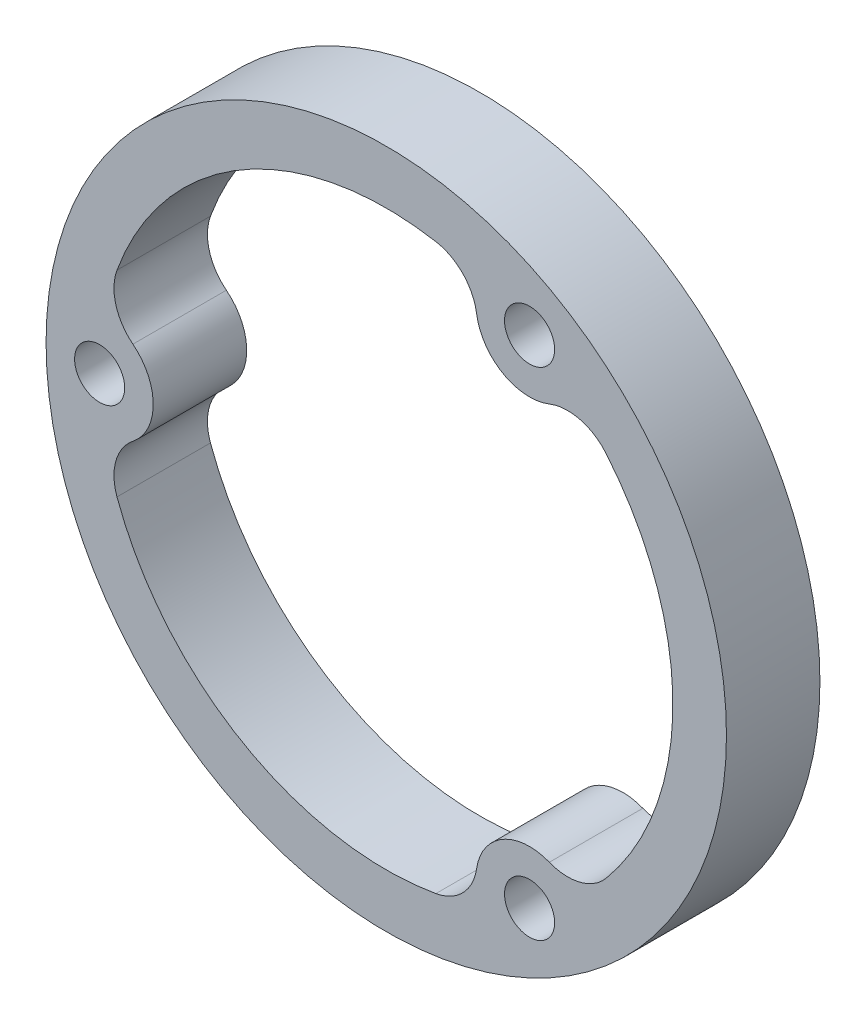
ISO-10303-21;
HEADER;
FILE_DESCRIPTION(('STEP AP214'),'2;1');
FILE_NAME('part.step','',(''),(''),'','','');
FILE_SCHEMA(('AUTOMOTIVE_DESIGN { 1 0 10303 214 1 1 1 1 }'));
ENDSEC;
DATA;
#1=APPLICATION_CONTEXT('core data for automotive mechanical design processes');
#2=APPLICATION_PROTOCOL_DEFINITION('international standard','automotive_design',2000,#1);
#3=PRODUCT_CONTEXT('',#1,'mechanical');
#4=PRODUCT('Part','Part','',(#3));
#5=PRODUCT_RELATED_PRODUCT_CATEGORY('part','',(#4));
#6=PRODUCT_DEFINITION_FORMATION('','',#4);
#7=PRODUCT_DEFINITION_CONTEXT('part definition',#1,'design');
#8=PRODUCT_DEFINITION('design','',#6,#7);
#9=PRODUCT_DEFINITION_SHAPE('','',#8);
#10=(LENGTH_UNIT() NAMED_UNIT(*) SI_UNIT(.MILLI.,.METRE.));
#11=(NAMED_UNIT(*) PLANE_ANGLE_UNIT() SI_UNIT($,.RADIAN.));
#12=(NAMED_UNIT(*) SI_UNIT($,.STERADIAN.) SOLID_ANGLE_UNIT());
#13=UNCERTAINTY_MEASURE_WITH_UNIT(LENGTH_MEASURE(1.E-05),#10,'distance_accuracy_value','');
#14=(GEOMETRIC_REPRESENTATION_CONTEXT(3) GLOBAL_UNCERTAINTY_ASSIGNED_CONTEXT((#13)) GLOBAL_UNIT_ASSIGNED_CONTEXT((#10,
#11,#12)) REPRESENTATION_CONTEXT('',''));
#15=CARTESIAN_POINT('',(0.,0.,0.));
#16=DIRECTION('',(0.,0.,1.));
#17=DIRECTION('',(1.,0.,0.));
#18=AXIS2_PLACEMENT_3D('',#15,#16,#17);
#19=CARTESIAN_POINT('',(0.,0.,9.525));
#20=DIRECTION('',(0.,0.,1.));
#21=DIRECTION('',(1.,0.,0.));
#22=AXIS2_PLACEMENT_3D('',#19,#20,#21);
#23=PLANE('',#22);
#24=CARTESIAN_POINT('',(14.6049999999998,25.2966020445436,9.525));
#25=DIRECTION('',(0.,0.,-1.));
#26=DIRECTION('',(-1.,0.,0.));
#27=AXIS2_PLACEMENT_3D('',#24,#25,#26);
#28=CIRCLE('',#27,2.5527);
#29=CARTESIAN_POINT('',(12.0522999999998,25.2966020445436,9.525));
#30=VERTEX_POINT('',#29);
#31=EDGE_CURVE('E419',#30,#30,#28,.T.);
#32=ORIENTED_EDGE('',*,*,#31,.T.);
#33=EDGE_LOOP('',(#32));
#34=FACE_BOUND('',#33,.T.);
#35=CARTESIAN_POINT('',(-29.21,-4.21584989140911E-13,9.525));
#36=DIRECTION('',(0.,0.,-1.));
#37=DIRECTION('',(-1.,0.,0.));
#38=AXIS2_PLACEMENT_3D('',#35,#36,#37);
#39=CIRCLE('',#38,2.5527);
#40=CARTESIAN_POINT('',(-31.7627,-4.21584989140911E-13,9.525));
#41=VERTEX_POINT('',#40);
#42=EDGE_CURVE('E429',#41,#41,#39,.T.);
#43=ORIENTED_EDGE('',*,*,#42,.T.);
#44=EDGE_LOOP('',(#43));
#45=FACE_BOUND('',#44,.T.);
#46=CARTESIAN_POINT('',(14.6050000000001,-25.2966020445434,9.525));
#47=DIRECTION('',(0.,0.,-1.));
#48=DIRECTION('',(-1.,0.,0.));
#49=AXIS2_PLACEMENT_3D('',#46,#47,#48);
#50=CIRCLE('',#49,2.5527);
#51=CARTESIAN_POINT('',(12.0523000000001,-25.2966020445434,9.525));
#52=VERTEX_POINT('',#51);
#53=EDGE_CURVE('E232',#52,#52,#50,.T.);
#54=ORIENTED_EDGE('',*,*,#53,.T.);
#55=EDGE_LOOP('',(#54));
#56=FACE_BOUND('',#55,.T.);
#57=CARTESIAN_POINT('',(0.,0.,9.525));
#58=DIRECTION('',(0.,0.,1.));
#59=DIRECTION('',(1.,0.,0.));
#60=AXIS2_PLACEMENT_3D('',#57,#58,#59);
#61=CIRCLE('',#60,34.671);
#62=CARTESIAN_POINT('',(-34.671,0.,9.525));
#63=VERTEX_POINT('',#62);
#64=EDGE_CURVE('E151',#63,#63,#61,.T.);
#65=ORIENTED_EDGE('',*,*,#64,.T.);
#66=EDGE_LOOP('',(#65));
#67=FACE_BOUND('',#66,.T.);
#68=CARTESIAN_POINT('',(-29.21,-4.21584989140911E-13,9.525));
#69=DIRECTION('',(0.,0.,-1.));
#70=DIRECTION('',(1.,0.,0.));
#71=AXIS2_PLACEMENT_3D('',#68,#69,#70);
#72=CIRCLE('',#71,5.46100000000001);
#73=CARTESIAN_POINT('',(-25.8216912257727,4.28274265517914,9.525));
#74=VERTEX_POINT('',#73);
#75=CARTESIAN_POINT('',(-25.8216912257726,-4.28274265517988,9.525));
#76=VERTEX_POINT('',#75);
#77=EDGE_CURVE('E212',#74,#76,#72,.T.);
#78=ORIENTED_EDGE('',*,*,#77,.F.);
#79=CARTESIAN_POINT('',(-22.6697760869566,8.26668931116012,9.525));
#80=DIRECTION('',(0.,0.,1.));
#81=DIRECTION('',(1.,0.,0.));
#82=AXIS2_PLACEMENT_3D('',#79,#80,#81);
#83=CIRCLE('',#82,5.08);
#84=CARTESIAN_POINT('',(-27.4423605263159,10.0070449556149,9.525));
#85=VERTEX_POINT('',#84);
#86=EDGE_CURVE('E196',#74,#85,#83,.F.);
#87=ORIENTED_EDGE('',*,*,#86,.T.);
#88=CARTESIAN_POINT('',(0.,0.,9.525));
#89=DIRECTION('',(0.,0.,1.));
#90=DIRECTION('',(1.,0.,0.));
#91=AXIS2_PLACEMENT_3D('',#88,#89,#90);
#92=CIRCLE('',#91,29.21);
#93=CARTESIAN_POINT('',(5.05482511478187,28.7693038334085,9.525));
#94=VERTEX_POINT('',#93);
#95=EDGE_CURVE('E147',#94,#85,#92,.T.);
#96=ORIENTED_EDGE('',*,*,#95,.F.);
#97=CARTESIAN_POINT('',(4.1757250948198,23.7659466449896,9.525));
#98=DIRECTION('',(0.,0.,1.));
#99=DIRECTION('',(1.,0.,0.));
#100=AXIS2_PLACEMENT_3D('',#97,#98,#99);
#101=CIRCLE('',#100,5.08);
#102=CARTESIAN_POINT('',(9.20188167562942,24.5036118977867,9.525));
#103=VERTEX_POINT('',#102);
#104=EDGE_CURVE('E137',#94,#103,#101,.F.);
#105=ORIENTED_EDGE('',*,*,#104,.T.);
#106=CARTESIAN_POINT('',(14.6049999999998,25.2966020445436,9.525));
#107=DIRECTION('',(0.,0.,-1.));
#108=DIRECTION('',(1.,0.,0.));
#109=AXIS2_PLACEMENT_3D('',#106,#107,#108);
#110=CIRCLE('',#109,5.46100000000001);
#111=CARTESIAN_POINT('',(16.6198095501428,20.2208692426073,9.525));
#112=VERTEX_POINT('',#111);
#113=EDGE_CURVE('E227',#112,#103,#110,.T.);
#114=ORIENTED_EDGE('',*,*,#113,.F.);
#115=CARTESIAN_POINT('',(18.4940509921363,15.4992573338293,9.525));
#116=DIRECTION('',(0.,0.,1.));
#117=DIRECTION('',(1.,0.,0.));
#118=AXIS2_PLACEMENT_3D('',#115,#116,#117);
#119=CIRCLE('',#118,5.08);
#120=CARTESIAN_POINT('',(22.3875354115334,18.7622588777934,9.525));
#121=VERTEX_POINT('',#120);
#122=EDGE_CURVE('E136',#112,#121,#119,.F.);
#123=ORIENTED_EDGE('',*,*,#122,.T.);
#124=CARTESIAN_POINT('',(0.,0.,9.525));
#125=DIRECTION('',(0.,0.,1.));
#126=DIRECTION('',(1.,0.,0.));
#127=AXIS2_PLACEMENT_3D('',#124,#125,#126);
#128=CIRCLE('',#127,29.21);
#129=CARTESIAN_POINT('',(22.3875354115337,-18.762258877793,9.525));
#130=VERTEX_POINT('',#129);
#131=EDGE_CURVE('E224',#130,#121,#128,.T.);
#132=ORIENTED_EDGE('',*,*,#131,.F.);
#133=CARTESIAN_POINT('',(18.4940509921366,-15.499257333829,9.525));
#134=DIRECTION('',(0.,0.,1.));
#135=DIRECTION('',(1.,0.,0.));
#136=AXIS2_PLACEMENT_3D('',#133,#134,#135);
#137=CIRCLE('',#136,5.08);
#138=CARTESIAN_POINT('',(16.6198095501431,-20.220869242607,9.525));
#139=VERTEX_POINT('',#138);
#140=EDGE_CURVE('E192',#130,#139,#137,.F.);
#141=ORIENTED_EDGE('',*,*,#140,.T.);
#142=CARTESIAN_POINT('',(14.6050000000001,-25.2966020445434,9.525));
#143=DIRECTION('',(0.,0.,-1.));
#144=DIRECTION('',(1.,0.,0.));
#145=AXIS2_PLACEMENT_3D('',#142,#143,#144);
#146=CIRCLE('',#145,5.46100000000001);
#147=CARTESIAN_POINT('',(9.20188167562977,-24.5036118977866,9.525));
#148=VERTEX_POINT('',#147);
#149=EDGE_CURVE('E216',#148,#139,#146,.T.);
#150=ORIENTED_EDGE('',*,*,#149,.F.);
#151=CARTESIAN_POINT('',(4.17572509482014,-23.7659466449895,9.525));
#152=DIRECTION('',(0.,0.,1.));
#153=DIRECTION('',(1.,0.,0.));
#154=AXIS2_PLACEMENT_3D('',#151,#152,#153);
#155=CIRCLE('',#154,5.08);
#156=CARTESIAN_POINT('',(5.05482511478227,-28.7693038334084,9.525));
#157=VERTEX_POINT('',#156);
#158=EDGE_CURVE('E188',#148,#157,#155,.F.);
#159=ORIENTED_EDGE('',*,*,#158,.T.);
#160=CARTESIAN_POINT('',(0.,0.,9.525));
#161=DIRECTION('',(0.,0.,1.));
#162=DIRECTION('',(1.,0.,0.));
#163=AXIS2_PLACEMENT_3D('',#160,#161,#162);
#164=CIRCLE('',#163,29.21);
#165=CARTESIAN_POINT('',(-27.4423605263156,-10.0070449556157,9.525));
#166=VERTEX_POINT('',#165);
#167=EDGE_CURVE('E214',#166,#157,#164,.T.);
#168=ORIENTED_EDGE('',*,*,#167,.F.);
#169=CARTESIAN_POINT('',(-22.6697760869564,-8.26668931116077,9.525));
#170=DIRECTION('',(0.,0.,1.));
#171=DIRECTION('',(1.,0.,0.));
#172=AXIS2_PLACEMENT_3D('',#169,#170,#171);
#173=CIRCLE('',#172,5.08);
#174=EDGE_CURVE('E11',#166,#76,#173,.F.);
#175=ORIENTED_EDGE('',*,*,#174,.T.);
#176=EDGE_LOOP('',(#78,#87,#96,#105,#114,#123,#132,#141,#150,#159,#168,#175));
#177=FACE_BOUND('',#176,.T.);
#178=ADVANCED_FACE('F37',(#34,#45,#56,#67,#177),#23,.T.);
#179=CARTESIAN_POINT('',(0.,0.,0.));
#180=DIRECTION('',(0.,0.,1.));
#181=DIRECTION('',(1.,0.,0.));
#182=AXIS2_PLACEMENT_3D('',#179,#180,#181);
#183=PLANE('',#182);
#184=CARTESIAN_POINT('',(14.6049999999998,25.2966020445436,0.));
#185=DIRECTION('',(0.,0.,-1.));
#186=DIRECTION('',(-1.,0.,0.));
#187=AXIS2_PLACEMENT_3D('',#184,#185,#186);
#188=CIRCLE('',#187,2.55269999999999);
#189=CARTESIAN_POINT('',(12.0522999999998,25.2966020445436,0.));
#190=VERTEX_POINT('',#189);
#191=EDGE_CURVE('E422',#190,#190,#188,.T.);
#192=ORIENTED_EDGE('',*,*,#191,.F.);
#193=EDGE_LOOP('',(#192));
#194=FACE_BOUND('',#193,.T.);
#195=CARTESIAN_POINT('',(-29.21,-4.21584989140911E-13,0.));
#196=DIRECTION('',(0.,0.,-1.));
#197=DIRECTION('',(-1.,0.,0.));
#198=AXIS2_PLACEMENT_3D('',#195,#196,#197);
#199=CIRCLE('',#198,2.55269999999999);
#200=CARTESIAN_POINT('',(-31.7627,-4.21584989140911E-13,0.));
#201=VERTEX_POINT('',#200);
#202=EDGE_CURVE('E424',#201,#201,#199,.T.);
#203=ORIENTED_EDGE('',*,*,#202,.F.);
#204=EDGE_LOOP('',(#203));
#205=FACE_BOUND('',#204,.T.);
#206=CARTESIAN_POINT('',(14.6050000000001,-25.2966020445434,0.));
#207=DIRECTION('',(0.,0.,-1.));
#208=DIRECTION('',(-1.,0.,0.));
#209=AXIS2_PLACEMENT_3D('',#206,#207,#208);
#210=CIRCLE('',#209,2.55269999999999);
#211=CARTESIAN_POINT('',(12.0523000000001,-25.2966020445434,0.));
#212=VERTEX_POINT('',#211);
#213=EDGE_CURVE('E432',#212,#212,#210,.T.);
#214=ORIENTED_EDGE('',*,*,#213,.F.);
#215=EDGE_LOOP('',(#214));
#216=FACE_BOUND('',#215,.T.);
#217=CARTESIAN_POINT('',(0.,0.,0.));
#218=DIRECTION('',(0.,0.,1.));
#219=DIRECTION('',(1.,0.,0.));
#220=AXIS2_PLACEMENT_3D('',#217,#218,#219);
#221=CIRCLE('',#220,34.671);
#222=CARTESIAN_POINT('',(-34.671,0.,0.));
#223=VERTEX_POINT('',#222);
#224=EDGE_CURVE('E156',#223,#223,#221,.T.);
#225=ORIENTED_EDGE('',*,*,#224,.F.);
#226=EDGE_LOOP('',(#225));
#227=FACE_BOUND('',#226,.T.);
#228=CARTESIAN_POINT('',(14.6049999999998,25.2966020445436,0.));
#229=DIRECTION('',(0.,0.,-1.));
#230=DIRECTION('',(1.,0.,0.));
#231=AXIS2_PLACEMENT_3D('',#228,#229,#230);
#232=CIRCLE('',#231,5.46100000000001);
#233=CARTESIAN_POINT('',(16.6198095501428,20.2208692426073,0.));
#234=VERTEX_POINT('',#233);
#235=CARTESIAN_POINT('',(9.20188167562942,24.5036118977867,0.));
#236=VERTEX_POINT('',#235);
#237=EDGE_CURVE('E129',#234,#236,#232,.T.);
#238=ORIENTED_EDGE('',*,*,#237,.T.);
#239=CARTESIAN_POINT('',(4.1757250948198,23.7659466449896,0.));
#240=DIRECTION('',(0.,0.,1.));
#241=DIRECTION('',(1.,0.,0.));
#242=AXIS2_PLACEMENT_3D('',#239,#240,#241);
#243=CIRCLE('',#242,5.08);
#244=CARTESIAN_POINT('',(5.05482511478187,28.7693038334085,0.));
#245=VERTEX_POINT('',#244);
#246=EDGE_CURVE('E182',#236,#245,#243,.T.);
#247=ORIENTED_EDGE('',*,*,#246,.T.);
#248=CARTESIAN_POINT('',(0.,0.,0.));
#249=DIRECTION('',(0.,0.,1.));
#250=DIRECTION('',(1.,0.,0.));
#251=AXIS2_PLACEMENT_3D('',#248,#249,#250);
#252=CIRCLE('',#251,29.21);
#253=CARTESIAN_POINT('',(-27.4423605263159,10.0070449556149,0.));
#254=VERTEX_POINT('',#253);
#255=EDGE_CURVE('E229',#245,#254,#252,.T.);
#256=ORIENTED_EDGE('',*,*,#255,.T.);
#257=CARTESIAN_POINT('',(-22.6697760869566,8.26668931116012,0.));
#258=DIRECTION('',(0.,0.,1.));
#259=DIRECTION('',(1.,0.,0.));
#260=AXIS2_PLACEMENT_3D('',#257,#258,#259);
#261=CIRCLE('',#260,5.08);
#262=CARTESIAN_POINT('',(-25.8216912257727,4.28274265517914,0.));
#263=VERTEX_POINT('',#262);
#264=EDGE_CURVE('E194',#254,#263,#261,.T.);
#265=ORIENTED_EDGE('',*,*,#264,.T.);
#266=CARTESIAN_POINT('',(-29.21,-4.21584989140911E-13,0.));
#267=DIRECTION('',(0.,0.,-1.));
#268=DIRECTION('',(1.,0.,0.));
#269=AXIS2_PLACEMENT_3D('',#266,#267,#268);
#270=CIRCLE('',#269,5.46100000000001);
#271=CARTESIAN_POINT('',(-25.8216912257726,-4.28274265517988,0.));
#272=VERTEX_POINT('',#271);
#273=EDGE_CURVE('E201',#263,#272,#270,.T.);
#274=ORIENTED_EDGE('',*,*,#273,.T.);
#275=CARTESIAN_POINT('',(-22.6697760869564,-8.26668931116077,0.));
#276=DIRECTION('',(0.,0.,1.));
#277=DIRECTION('',(1.,0.,0.));
#278=AXIS2_PLACEMENT_3D('',#275,#276,#277);
#279=CIRCLE('',#278,5.08);
#280=CARTESIAN_POINT('',(-27.4423605263156,-10.0070449556157,0.));
#281=VERTEX_POINT('',#280);
#282=EDGE_CURVE('E45',#272,#281,#279,.T.);
#283=ORIENTED_EDGE('',*,*,#282,.T.);
#284=CARTESIAN_POINT('',(0.,0.,0.));
#285=DIRECTION('',(0.,0.,1.));
#286=DIRECTION('',(1.,0.,0.));
#287=AXIS2_PLACEMENT_3D('',#284,#285,#286);
#288=CIRCLE('',#287,29.21);
#289=CARTESIAN_POINT('',(5.05482511478227,-28.7693038334084,0.));
#290=VERTEX_POINT('',#289);
#291=EDGE_CURVE('E200',#281,#290,#288,.T.);
#292=ORIENTED_EDGE('',*,*,#291,.T.);
#293=CARTESIAN_POINT('',(4.17572509482014,-23.7659466449895,0.));
#294=DIRECTION('',(0.,0.,1.));
#295=DIRECTION('',(1.,0.,0.));
#296=AXIS2_PLACEMENT_3D('',#293,#294,#295);
#297=CIRCLE('',#296,5.08);
#298=CARTESIAN_POINT('',(9.20188167562977,-24.5036118977866,0.));
#299=VERTEX_POINT('',#298);
#300=EDGE_CURVE('E186',#290,#299,#297,.T.);
#301=ORIENTED_EDGE('',*,*,#300,.T.);
#302=CARTESIAN_POINT('',(14.6050000000001,-25.2966020445434,0.));
#303=DIRECTION('',(0.,0.,-1.));
#304=DIRECTION('',(1.,0.,0.));
#305=AXIS2_PLACEMENT_3D('',#302,#303,#304);
#306=CIRCLE('',#305,5.46100000000001);
#307=CARTESIAN_POINT('',(16.6198095501431,-20.220869242607,0.));
#308=VERTEX_POINT('',#307);
#309=EDGE_CURVE('E209',#299,#308,#306,.T.);
#310=ORIENTED_EDGE('',*,*,#309,.T.);
#311=CARTESIAN_POINT('',(18.4940509921366,-15.499257333829,0.));
#312=DIRECTION('',(0.,0.,1.));
#313=DIRECTION('',(1.,0.,0.));
#314=AXIS2_PLACEMENT_3D('',#311,#312,#313);
#315=CIRCLE('',#314,5.08);
#316=CARTESIAN_POINT('',(22.3875354115337,-18.762258877793,0.));
#317=VERTEX_POINT('',#316);
#318=EDGE_CURVE('E190',#308,#317,#315,.T.);
#319=ORIENTED_EDGE('',*,*,#318,.T.);
#320=CARTESIAN_POINT('',(0.,0.,0.));
#321=DIRECTION('',(0.,0.,1.));
#322=DIRECTION('',(1.,0.,0.));
#323=AXIS2_PLACEMENT_3D('',#320,#321,#322);
#324=CIRCLE('',#323,29.21);
#325=CARTESIAN_POINT('',(22.3875354115334,18.7622588777934,0.));
#326=VERTEX_POINT('',#325);
#327=EDGE_CURVE('E131',#317,#326,#324,.T.);
#328=ORIENTED_EDGE('',*,*,#327,.T.);
#329=CARTESIAN_POINT('',(18.4940509921363,15.4992573338293,0.));
#330=DIRECTION('',(0.,0.,1.));
#331=DIRECTION('',(1.,0.,0.));
#332=AXIS2_PLACEMENT_3D('',#329,#330,#331);
#333=CIRCLE('',#332,5.08);
#334=EDGE_CURVE('E126',#326,#234,#333,.T.);
#335=ORIENTED_EDGE('',*,*,#334,.T.);
#336=EDGE_LOOP('',(#238,#247,#256,#265,#274,#283,#292,#301,#310,#319,#328,#335));
#337=FACE_BOUND('',#336,.T.);
#338=ADVANCED_FACE('F128',(#194,#205,#216,#227,#337),#183,.F.);
#339=CARTESIAN_POINT('',(0.,0.,9.525));
#340=DIRECTION('',(0.,0.,-1.));
#341=DIRECTION('',(-1.,0.,0.));
#342=AXIS2_PLACEMENT_3D('',#339,#340,#341);
#343=CYLINDRICAL_SURFACE('',#342,34.671);
#344=CARTESIAN_POINT('',(-34.671,0.,9.525));
#345=CARTESIAN_POINT('',(-34.671,0.,9.42578125));
#346=CARTESIAN_POINT('',(-34.671,0.,9.3265625));
#347=CARTESIAN_POINT('',(-34.671,0.,9.128125));
#348=CARTESIAN_POINT('',(-34.671,0.,9.02890625));
#349=CARTESIAN_POINT('',(-34.671,0.,8.83046875));
#350=CARTESIAN_POINT('',(-34.671,0.,8.73125));
#351=CARTESIAN_POINT('',(-34.671,0.,8.5328125));
#352=CARTESIAN_POINT('',(-34.671,0.,8.43359375));
#353=CARTESIAN_POINT('',(-34.671,0.,8.23515625));
#354=CARTESIAN_POINT('',(-34.671,0.,8.1359375));
#355=CARTESIAN_POINT('',(-34.671,0.,7.9375));
#356=CARTESIAN_POINT('',(-34.671,0.,7.83828125));
#357=CARTESIAN_POINT('',(-34.671,0.,7.63984375));
#358=CARTESIAN_POINT('',(-34.671,0.,7.540625));
#359=CARTESIAN_POINT('',(-34.671,0.,7.3421875));
#360=CARTESIAN_POINT('',(-34.671,0.,7.24296875));
#361=CARTESIAN_POINT('',(-34.671,0.,7.04453125));
#362=CARTESIAN_POINT('',(-34.671,0.,6.9453125));
#363=CARTESIAN_POINT('',(-34.671,0.,6.746875));
#364=CARTESIAN_POINT('',(-34.671,0.,6.64765625));
#365=CARTESIAN_POINT('',(-34.671,0.,6.44921875));
#366=CARTESIAN_POINT('',(-34.671,0.,6.35));
#367=CARTESIAN_POINT('',(-34.671,0.,6.1515625));
#368=CARTESIAN_POINT('',(-34.671,0.,6.05234375));
#369=CARTESIAN_POINT('',(-34.671,0.,5.85390625));
#370=CARTESIAN_POINT('',(-34.671,0.,5.7546875));
#371=CARTESIAN_POINT('',(-34.671,0.,5.55625));
#372=CARTESIAN_POINT('',(-34.671,0.,5.45703125));
#373=CARTESIAN_POINT('',(-34.671,0.,5.25859375));
#374=CARTESIAN_POINT('',(-34.671,0.,5.159375));
#375=CARTESIAN_POINT('',(-34.671,0.,4.9609375));
#376=CARTESIAN_POINT('',(-34.671,0.,4.86171875));
#377=CARTESIAN_POINT('',(-34.671,0.,4.66328125));
#378=CARTESIAN_POINT('',(-34.671,0.,4.5640625));
#379=CARTESIAN_POINT('',(-34.671,0.,4.365625));
#380=CARTESIAN_POINT('',(-34.671,0.,4.26640625));
#381=CARTESIAN_POINT('',(-34.671,0.,4.06796875));
#382=CARTESIAN_POINT('',(-34.671,0.,3.96875));
#383=CARTESIAN_POINT('',(-34.671,0.,3.7703125));
#384=CARTESIAN_POINT('',(-34.671,0.,3.67109375));
#385=CARTESIAN_POINT('',(-34.671,0.,3.47265625));
#386=CARTESIAN_POINT('',(-34.671,0.,3.3734375));
#387=CARTESIAN_POINT('',(-34.671,0.,3.175));
#388=CARTESIAN_POINT('',(-34.671,0.,3.07578125));
#389=CARTESIAN_POINT('',(-34.671,0.,2.87734375));
#390=CARTESIAN_POINT('',(-34.671,0.,2.778125));
#391=CARTESIAN_POINT('',(-34.671,0.,2.5796875));
#392=CARTESIAN_POINT('',(-34.671,0.,2.48046875));
#393=CARTESIAN_POINT('',(-34.671,0.,2.28203125));
#394=CARTESIAN_POINT('',(-34.671,0.,2.1828125));
#395=CARTESIAN_POINT('',(-34.671,0.,1.984375));
#396=CARTESIAN_POINT('',(-34.671,0.,1.88515625));
#397=CARTESIAN_POINT('',(-34.671,0.,1.68671875));
#398=CARTESIAN_POINT('',(-34.671,0.,1.5875));
#399=CARTESIAN_POINT('',(-34.671,0.,1.3890625));
#400=CARTESIAN_POINT('',(-34.671,0.,1.28984375));
#401=CARTESIAN_POINT('',(-34.671,0.,1.09140625));
#402=CARTESIAN_POINT('',(-34.671,0.,0.992187500000001));
#403=CARTESIAN_POINT('',(-34.671,0.,0.793750000000001));
#404=CARTESIAN_POINT('',(-34.671,0.,0.69453125));
#405=CARTESIAN_POINT('',(-34.671,0.,0.49609375));
#406=CARTESIAN_POINT('',(-34.671,0.,0.396875));
#407=CARTESIAN_POINT('',(-34.671,0.,0.1984375));
#408=CARTESIAN_POINT('',(-34.671,0.,0.0992187500000001));
#409=CARTESIAN_POINT('',(-34.671,0.,0.));
#410=B_SPLINE_CURVE_WITH_KNOTS('',3,(#344,#345,#346,#347,#348,#349,#350,#351,#352,#353,#354,
#355,#356,#357,#358,#359,#360,#361,#362,#363,#364,#365,#366,#367,#368,#369,#370,#371,#372,#373,
#374,#375,#376,#377,#378,#379,#380,#381,#382,#383,#384,#385,#386,#387,#388,#389,#390,#391,#392,
#393,#394,#395,#396,#397,#398,#399,#400,#401,#402,#403,#404,#405,#406,#407,#408,#409),
.UNSPECIFIED.,.F.,.F.,(4,2,2,2,2,2,2,2,2,2,2,2,2,2,2,2,2,2,2,2,2,2,2,2,2,2,2,2,2,2,2,2,4),(0.,
0.297656249999998,0.595312499999999,0.892968749999999,1.190625,1.48828125,1.7859375,2.08359375,
2.38125,2.67890625,2.9765625,3.27421875,3.571875,3.86953125,4.1671875,4.46484375,4.7625,
5.06015625,5.3578125,5.65546875,5.953125,6.25078125,6.5484375,6.84609375,7.14375,7.44140625,
7.7390625,8.03671875,8.334375,8.63203125,8.9296875,9.22734375,9.525),.UNSPECIFIED.);
#411=EDGE_CURVE('BSEAM276',#63,#223,#410,.T.);
#412=ORIENTED_EDGE('',*,*,#64,.F.);
#413=ORIENTED_EDGE('',*,*,#224,.T.);
#414=ORIENTED_EDGE('',*,*,#411,.T.);
#415=ORIENTED_EDGE('',*,*,#411,.F.);
#416=EDGE_LOOP('',(#412,#414,#413,#415));
#417=FACE_BOUND('',#416,.T.);
#418=ADVANCED_FACE('F276',(#417),#343,.T.);
#419=CARTESIAN_POINT('',(0.,0.,9.525));
#420=DIRECTION('',(0.,0.,-1.));
#421=DIRECTION('',(-1.,0.,0.));
#422=AXIS2_PLACEMENT_3D('',#419,#420,#421);
#423=CYLINDRICAL_SURFACE('',#422,29.21);
#424=ORIENTED_EDGE('',*,*,#255,.F.);
#425=DIRECTION('',(0.,0.,-1.));
#426=VECTOR('',#425,1.);
#427=CARTESIAN_POINT('',(5.05482511478187,28.7693038334085,9.525));
#428=LINE('',#427,#426);
#429=EDGE_CURVE('E162',#245,#94,#428,.F.);
#430=ORIENTED_EDGE('',*,*,#429,.T.);
#431=ORIENTED_EDGE('',*,*,#95,.T.);
#432=DIRECTION('',(0.,0.,-1.));
#433=VECTOR('',#432,1.);
#434=CARTESIAN_POINT('',(-27.4423605263159,10.0070449556149,9.525));
#435=LINE('',#434,#433);
#436=EDGE_CURVE('E153',#85,#254,#435,.T.);
#437=ORIENTED_EDGE('',*,*,#436,.T.);
#438=EDGE_LOOP('',(#424,#430,#431,#437));
#439=FACE_BOUND('',#438,.T.);
#440=ADVANCED_FACE('F259',(#439),#423,.F.);
#441=CARTESIAN_POINT('',(-29.21,-4.21584989140911E-13,9.525));
#442=DIRECTION('',(0.,0.,-1.));
#443=DIRECTION('',(-1.,0.,0.));
#444=AXIS2_PLACEMENT_3D('',#441,#442,#443);
#445=CYLINDRICAL_SURFACE('',#444,5.46100000000001);
#446=ORIENTED_EDGE('',*,*,#273,.F.);
#447=DIRECTION('',(0.,0.,-1.));
#448=VECTOR('',#447,1.);
#449=CARTESIAN_POINT('',(-25.8216912257727,4.28274265517914,9.525));
#450=LINE('',#449,#448);
#451=EDGE_CURVE('E57',#263,#74,#450,.F.);
#452=ORIENTED_EDGE('',*,*,#451,.T.);
#453=ORIENTED_EDGE('',*,*,#77,.T.);
#454=DIRECTION('',(0.,0.,-1.));
#455=VECTOR('',#454,1.);
#456=CARTESIAN_POINT('',(-25.8216912257726,-4.28274265517988,9.525));
#457=LINE('',#456,#455);
#458=EDGE_CURVE('E178',#76,#272,#457,.T.);
#459=ORIENTED_EDGE('',*,*,#458,.T.);
#460=EDGE_LOOP('',(#446,#452,#453,#459));
#461=FACE_BOUND('',#460,.T.);
#462=ADVANCED_FACE('F211',(#461),#445,.T.);
#463=CARTESIAN_POINT('',(0.,0.,9.525));
#464=DIRECTION('',(0.,0.,-1.));
#465=DIRECTION('',(-1.,0.,0.));
#466=AXIS2_PLACEMENT_3D('',#463,#464,#465);
#467=CYLINDRICAL_SURFACE('',#466,29.21);
#468=ORIENTED_EDGE('',*,*,#167,.T.);
#469=DIRECTION('',(0.,0.,-1.));
#470=VECTOR('',#469,1.);
#471=CARTESIAN_POINT('',(5.05482511478227,-28.7693038334084,9.525));
#472=LINE('',#471,#470);
#473=EDGE_CURVE('E170',#157,#290,#472,.T.);
#474=ORIENTED_EDGE('',*,*,#473,.T.);
#475=ORIENTED_EDGE('',*,*,#291,.F.);
#476=DIRECTION('',(0.,0.,-1.));
#477=VECTOR('',#476,1.);
#478=CARTESIAN_POINT('',(-27.4423605263156,-10.0070449556157,9.525));
#479=LINE('',#478,#477);
#480=EDGE_CURVE('E168',#281,#166,#479,.F.);
#481=ORIENTED_EDGE('',*,*,#480,.T.);
#482=EDGE_LOOP('',(#468,#474,#475,#481));
#483=FACE_BOUND('',#482,.T.);
#484=ADVANCED_FACE('F207',(#483),#467,.F.);
#485=CARTESIAN_POINT('',(14.6050000000001,-25.2966020445434,9.525));
#486=DIRECTION('',(0.,0.,-1.));
#487=DIRECTION('',(-1.,0.,0.));
#488=AXIS2_PLACEMENT_3D('',#485,#486,#487);
#489=CYLINDRICAL_SURFACE('',#488,5.46100000000001);
#490=ORIENTED_EDGE('',*,*,#309,.F.);
#491=DIRECTION('',(0.,0.,-1.));
#492=VECTOR('',#491,1.);
#493=CARTESIAN_POINT('',(9.20188167562977,-24.5036118977866,9.525));
#494=LINE('',#493,#492);
#495=EDGE_CURVE('E176',#299,#148,#494,.F.);
#496=ORIENTED_EDGE('',*,*,#495,.T.);
#497=ORIENTED_EDGE('',*,*,#149,.T.);
#498=DIRECTION('',(0.,0.,-1.));
#499=VECTOR('',#498,1.);
#500=CARTESIAN_POINT('',(16.6198095501431,-20.220869242607,9.525));
#501=LINE('',#500,#499);
#502=EDGE_CURVE('E173',#139,#308,#501,.T.);
#503=ORIENTED_EDGE('',*,*,#502,.T.);
#504=EDGE_LOOP('',(#490,#496,#497,#503));
#505=FACE_BOUND('',#504,.T.);
#506=ADVANCED_FACE('F239',(#505),#489,.T.);
#507=CARTESIAN_POINT('',(0.,0.,9.525));
#508=DIRECTION('',(0.,0.,-1.));
#509=DIRECTION('',(-1.,0.,0.));
#510=AXIS2_PLACEMENT_3D('',#507,#508,#509);
#511=CYLINDRICAL_SURFACE('',#510,29.21);
#512=ORIENTED_EDGE('',*,*,#131,.T.);
#513=DIRECTION('',(0.,0.,-1.));
#514=VECTOR('',#513,1.);
#515=CARTESIAN_POINT('',(22.3875354115334,18.7622588777934,9.525));
#516=LINE('',#515,#514);
#517=EDGE_CURVE('E166',#121,#326,#516,.T.);
#518=ORIENTED_EDGE('',*,*,#517,.T.);
#519=ORIENTED_EDGE('',*,*,#327,.F.);
#520=DIRECTION('',(0.,0.,-1.));
#521=VECTOR('',#520,1.);
#522=CARTESIAN_POINT('',(22.3875354115337,-18.762258877793,9.525));
#523=LINE('',#522,#521);
#524=EDGE_CURVE('E164',#317,#130,#523,.F.);
#525=ORIENTED_EDGE('',*,*,#524,.T.);
#526=EDGE_LOOP('',(#512,#518,#519,#525));
#527=FACE_BOUND('',#526,.T.);
#528=ADVANCED_FACE('F251',(#527),#511,.F.);
#529=CARTESIAN_POINT('',(14.6049999999998,25.2966020445436,9.525));
#530=DIRECTION('',(0.,0.,-1.));
#531=DIRECTION('',(-1.,0.,0.));
#532=AXIS2_PLACEMENT_3D('',#529,#530,#531);
#533=CYLINDRICAL_SURFACE('',#532,5.46100000000001);
#534=ORIENTED_EDGE('',*,*,#113,.T.);
#535=DIRECTION('',(0.,0.,-1.));
#536=VECTOR('',#535,1.);
#537=CARTESIAN_POINT('',(9.20188167562942,24.5036118977867,9.525));
#538=LINE('',#537,#536);
#539=EDGE_CURVE('E146',#103,#236,#538,.T.);
#540=ORIENTED_EDGE('',*,*,#539,.T.);
#541=ORIENTED_EDGE('',*,*,#237,.F.);
#542=DIRECTION('',(0.,0.,-1.));
#543=VECTOR('',#542,1.);
#544=CARTESIAN_POINT('',(16.6198095501428,20.2208692426073,9.525));
#545=LINE('',#544,#543);
#546=EDGE_CURVE('E143',#234,#112,#545,.F.);
#547=ORIENTED_EDGE('',*,*,#546,.T.);
#548=EDGE_LOOP('',(#534,#540,#541,#547));
#549=FACE_BOUND('',#548,.T.);
#550=ADVANCED_FACE('F142',(#549),#533,.T.);
#551=CARTESIAN_POINT('',(4.1757250948198,23.7659466449896,9.525));
#552=DIRECTION('',(0.,0.,-1.));
#553=DIRECTION('',(-1.,0.,0.));
#554=AXIS2_PLACEMENT_3D('',#551,#552,#553);
#555=CYLINDRICAL_SURFACE('',#554,5.08);
#556=ORIENTED_EDGE('',*,*,#104,.F.);
#557=ORIENTED_EDGE('',*,*,#429,.F.);
#558=ORIENTED_EDGE('',*,*,#246,.F.);
#559=ORIENTED_EDGE('',*,*,#539,.F.);
#560=EDGE_LOOP('',(#556,#557,#558,#559));
#561=FACE_BOUND('',#560,.T.);
#562=ADVANCED_FACE('F255',(#561),#555,.F.);
#563=CARTESIAN_POINT('',(18.4940509921363,15.4992573338293,9.525));
#564=DIRECTION('',(0.,0.,-1.));
#565=DIRECTION('',(-1.,0.,0.));
#566=AXIS2_PLACEMENT_3D('',#563,#564,#565);
#567=CYLINDRICAL_SURFACE('',#566,5.08);
#568=ORIENTED_EDGE('',*,*,#122,.F.);
#569=ORIENTED_EDGE('',*,*,#546,.F.);
#570=ORIENTED_EDGE('',*,*,#334,.F.);
#571=ORIENTED_EDGE('',*,*,#517,.F.);
#572=EDGE_LOOP('',(#568,#569,#570,#571));
#573=FACE_BOUND('',#572,.T.);
#574=ADVANCED_FACE('F150',(#573),#567,.F.);
#575=CARTESIAN_POINT('',(4.17572509482014,-23.7659466449895,9.525));
#576=DIRECTION('',(0.,0.,-1.));
#577=DIRECTION('',(-1.,0.,0.));
#578=AXIS2_PLACEMENT_3D('',#575,#576,#577);
#579=CYLINDRICAL_SURFACE('',#578,5.08);
#580=ORIENTED_EDGE('',*,*,#158,.F.);
#581=ORIENTED_EDGE('',*,*,#495,.F.);
#582=ORIENTED_EDGE('',*,*,#300,.F.);
#583=ORIENTED_EDGE('',*,*,#473,.F.);
#584=EDGE_LOOP('',(#580,#581,#582,#583));
#585=FACE_BOUND('',#584,.T.);
#586=ADVANCED_FACE('F244',(#585),#579,.F.);
#587=CARTESIAN_POINT('',(18.4940509921366,-15.499257333829,9.525));
#588=DIRECTION('',(0.,0.,-1.));
#589=DIRECTION('',(-1.,0.,0.));
#590=AXIS2_PLACEMENT_3D('',#587,#588,#589);
#591=CYLINDRICAL_SURFACE('',#590,5.08);
#592=ORIENTED_EDGE('',*,*,#140,.F.);
#593=ORIENTED_EDGE('',*,*,#524,.F.);
#594=ORIENTED_EDGE('',*,*,#318,.F.);
#595=ORIENTED_EDGE('',*,*,#502,.F.);
#596=EDGE_LOOP('',(#592,#593,#594,#595));
#597=FACE_BOUND('',#596,.T.);
#598=ADVANCED_FACE('F248',(#597),#591,.F.);
#599=CARTESIAN_POINT('',(-22.6697760869566,8.26668931116012,9.525));
#600=DIRECTION('',(0.,0.,-1.));
#601=DIRECTION('',(-1.,0.,0.));
#602=AXIS2_PLACEMENT_3D('',#599,#600,#601);
#603=CYLINDRICAL_SURFACE('',#602,5.08);
#604=ORIENTED_EDGE('',*,*,#86,.F.);
#605=ORIENTED_EDGE('',*,*,#451,.F.);
#606=ORIENTED_EDGE('',*,*,#264,.F.);
#607=ORIENTED_EDGE('',*,*,#436,.F.);
#608=EDGE_LOOP('',(#604,#605,#606,#607));
#609=FACE_BOUND('',#608,.T.);
#610=ADVANCED_FACE('F262',(#609),#603,.F.);
#611=CARTESIAN_POINT('',(-22.6697760869564,-8.26668931116077,9.525));
#612=DIRECTION('',(0.,0.,-1.));
#613=DIRECTION('',(-1.,0.,0.));
#614=AXIS2_PLACEMENT_3D('',#611,#612,#613);
#615=CYLINDRICAL_SURFACE('',#614,5.08);
#616=ORIENTED_EDGE('',*,*,#174,.F.);
#617=ORIENTED_EDGE('',*,*,#480,.F.);
#618=ORIENTED_EDGE('',*,*,#282,.F.);
#619=ORIENTED_EDGE('',*,*,#458,.F.);
#620=EDGE_LOOP('',(#616,#617,#618,#619));
#621=FACE_BOUND('',#620,.T.);
#622=ADVANCED_FACE('F39',(#621),#615,.F.);
#623=CARTESIAN_POINT('',(14.6050000000001,-25.2966020445434,0.));
#624=DIRECTION('',(0.,0.,-1.));
#625=DIRECTION('',(-1.,0.,0.));
#626=AXIS2_PLACEMENT_3D('',#623,#624,#625);
#627=CYLINDRICAL_SURFACE('',#626,2.55269999999999);
#628=ORIENTED_EDGE('',*,*,#53,.F.);
#629=EDGE_LOOP('',(#628));
#630=FACE_BOUND('',#629,.T.);
#631=ORIENTED_EDGE('',*,*,#213,.T.);
#632=EDGE_LOOP('',(#631));
#633=FACE_BOUND('',#632,.T.);
#634=ADVANCED_FACE('F268',(#630,#633),#627,.F.);
#635=CARTESIAN_POINT('',(-29.21,-4.21584989140911E-13,0.));
#636=DIRECTION('',(0.,0.,-1.));
#637=DIRECTION('',(-1.,0.,0.));
#638=AXIS2_PLACEMENT_3D('',#635,#636,#637);
#639=CYLINDRICAL_SURFACE('',#638,2.55269999999999);
#640=ORIENTED_EDGE('',*,*,#42,.F.);
#641=EDGE_LOOP('',(#640));
#642=FACE_BOUND('',#641,.T.);
#643=ORIENTED_EDGE('',*,*,#202,.T.);
#644=EDGE_LOOP('',(#643));
#645=FACE_BOUND('',#644,.T.);
#646=ADVANCED_FACE('F330',(#642,#645),#639,.F.);
#647=CARTESIAN_POINT('',(14.6049999999998,25.2966020445436,0.));
#648=DIRECTION('',(0.,0.,-1.));
#649=DIRECTION('',(-1.,0.,0.));
#650=AXIS2_PLACEMENT_3D('',#647,#648,#649);
#651=CYLINDRICAL_SURFACE('',#650,2.55269999999999);
#652=ORIENTED_EDGE('',*,*,#31,.F.);
#653=EDGE_LOOP('',(#652));
#654=FACE_BOUND('',#653,.T.);
#655=ORIENTED_EDGE('',*,*,#191,.T.);
#656=EDGE_LOOP('',(#655));
#657=FACE_BOUND('',#656,.T.);
#658=ADVANCED_FACE('F340',(#654,#657),#651,.F.);
#659=CLOSED_SHELL('',(#178,#338,#418,#440,#462,#484,#506,#528,#550,#562,#574,#586,#598,#610,
#622,#634,#646,#658));
#660=MANIFOLD_SOLID_BREP('B2',#659);
#661=ADVANCED_BREP_SHAPE_REPRESENTATION('',(#18,#660),#14);
#662=SHAPE_DEFINITION_REPRESENTATION(#9,#661);
ENDSEC;
END-ISO-10303-21;
